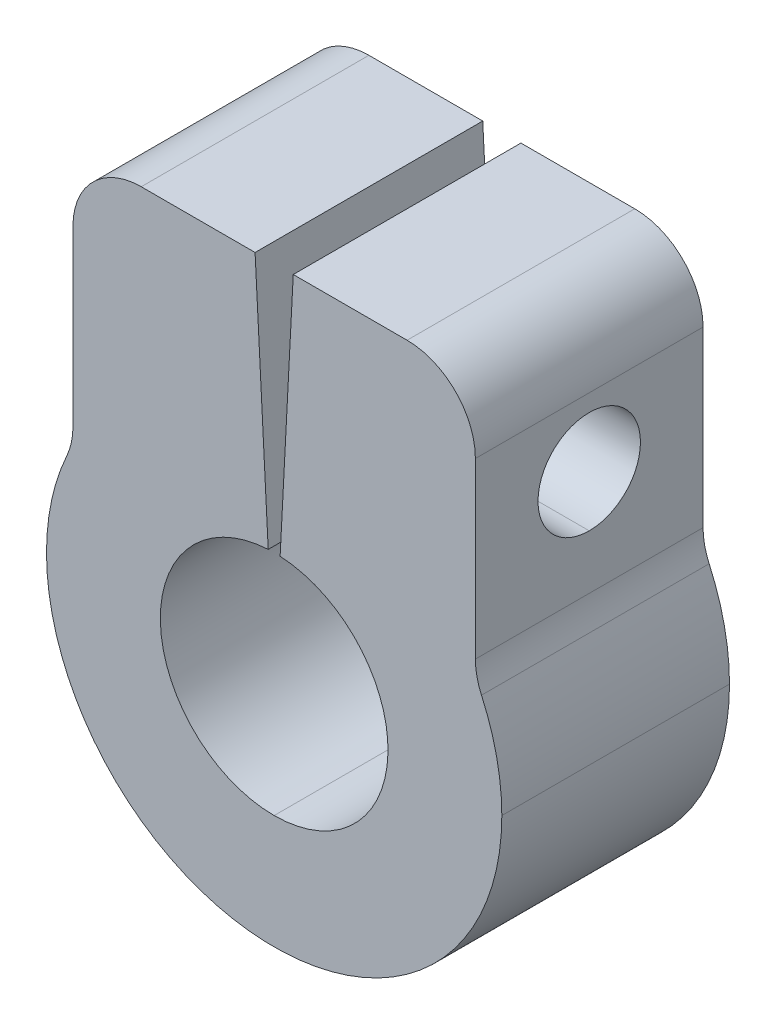
ISO-10303-21;
HEADER;
FILE_DESCRIPTION(('STEP AP214'),'2;1');
FILE_NAME('part.step','',(''),(''),'','','');
FILE_SCHEMA(('AUTOMOTIVE_DESIGN { 1 0 10303 214 1 1 1 1 }'));
ENDSEC;
DATA;
#1=APPLICATION_CONTEXT('core data for automotive mechanical design processes');
#2=APPLICATION_PROTOCOL_DEFINITION('international standard','automotive_design',2000,#1);
#3=PRODUCT_CONTEXT('',#1,'mechanical');
#4=PRODUCT('Part','Part','',(#3));
#5=PRODUCT_RELATED_PRODUCT_CATEGORY('part','',(#4));
#6=PRODUCT_DEFINITION_FORMATION('','',#4);
#7=PRODUCT_DEFINITION_CONTEXT('part definition',#1,'design');
#8=PRODUCT_DEFINITION('design','',#6,#7);
#9=PRODUCT_DEFINITION_SHAPE('','',#8);
#10=(LENGTH_UNIT() NAMED_UNIT(*) SI_UNIT(.MILLI.,.METRE.));
#11=(NAMED_UNIT(*) PLANE_ANGLE_UNIT() SI_UNIT($,.RADIAN.));
#12=(NAMED_UNIT(*) SI_UNIT($,.STERADIAN.) SOLID_ANGLE_UNIT());
#13=UNCERTAINTY_MEASURE_WITH_UNIT(LENGTH_MEASURE(1.E-05),#10,'distance_accuracy_value','');
#14=(GEOMETRIC_REPRESENTATION_CONTEXT(3) GLOBAL_UNCERTAINTY_ASSIGNED_CONTEXT((#13)) GLOBAL_UNIT_ASSIGNED_CONTEXT((#10,
#11,#12)) REPRESENTATION_CONTEXT('',''));
#15=CARTESIAN_POINT('',(0.,0.,0.));
#16=DIRECTION('',(0.,0.,1.));
#17=DIRECTION('',(1.,0.,0.));
#18=AXIS2_PLACEMENT_3D('',#15,#16,#17);
#19=CARTESIAN_POINT('',(3.83852446853,0.,0.));
#20=DIRECTION('',(1.,0.,0.));
#21=DIRECTION('',(0.,1.,0.));
#22=AXIS2_PLACEMENT_3D('',#19,#20,#21);
#23=PLANE('',#22);
#24=CARTESIAN_POINT('',(3.83852446853,10.,5.));
#25=DIRECTION('',(1.,0.,0.));
#26=DIRECTION('',(0.,-1.,0.));
#27=AXIS2_PLACEMENT_3D('',#24,#25,#26);
#28=CIRCLE('',#27,1.8);
#29=CARTESIAN_POINT('',(3.83852446853,8.2,5.));
#30=VERTEX_POINT('',#29);
#31=CARTESIAN_POINT('',(3.83852446853,11.8,5.));
#32=VERTEX_POINT('',#31);
#33=EDGE_CURVE('E268',#30,#32,#28,.T.);
#34=ORIENTED_EDGE('',*,*,#33,.F.);
#35=CARTESIAN_POINT('',(3.83852446853,10.,5.));
#36=DIRECTION('',(1.,0.,0.));
#37=DIRECTION('',(0.,-1.,0.));
#38=AXIS2_PLACEMENT_3D('',#35,#36,#37);
#39=CIRCLE('',#38,1.8);
#40=EDGE_CURVE('E305',#32,#30,#39,.T.);
#41=ORIENTED_EDGE('',*,*,#40,.F.);
#42=EDGE_LOOP('',(#34,#41));
#43=FACE_BOUND('',#42,.T.);
#44=CARTESIAN_POINT('',(3.83852446853,10.,5.));
#45=DIRECTION('',(1.,0.,0.));
#46=DIRECTION('',(0.,1.,0.));
#47=AXIS2_PLACEMENT_3D('',#44,#45,#46);
#48=CIRCLE('',#47,2.25);
#49=CARTESIAN_POINT('',(3.83852446853,12.25,5.));
#50=VERTEX_POINT('',#49);
#51=CARTESIAN_POINT('',(3.83852446853,7.75,5.));
#52=VERTEX_POINT('',#51);
#53=EDGE_CURVE('E29',#50,#52,#48,.T.);
#54=ORIENTED_EDGE('',*,*,#53,.T.);
#55=CARTESIAN_POINT('',(3.83852446853,10.,5.));
#56=DIRECTION('',(1.,0.,0.));
#57=DIRECTION('',(0.,1.,0.));
#58=AXIS2_PLACEMENT_3D('',#55,#56,#57);
#59=CIRCLE('',#58,2.25);
#60=EDGE_CURVE('E11',#52,#50,#59,.T.);
#61=ORIENTED_EDGE('',*,*,#60,.T.);
#62=EDGE_LOOP('',(#54,#61));
#63=FACE_BOUND('',#62,.T.);
#64=ADVANCED_FACE('F16',(#43,#63),#23,.T.);
#65=CARTESIAN_POINT('',(6.33852446853,10.,5.));
#66=DIRECTION('',(1.,0.,0.));
#67=DIRECTION('',(0.,1.,0.));
#68=AXIS2_PLACEMENT_3D('',#65,#66,#67);
#69=CYLINDRICAL_SURFACE('',#68,2.25);
#70=DIRECTION('',(-1.,0.,0.));
#71=VECTOR('',#70,1.);
#72=CARTESIAN_POINT('',(6.33852446853,7.75,5.));
#73=LINE('',#72,#71);
#74=CARTESIAN_POINT('',(8.83852446853,7.75,5.));
#75=VERTEX_POINT('',#74);
#76=EDGE_CURVE('E259',#75,#52,#73,.T.);
#77=ORIENTED_EDGE('',*,*,#76,.F.);
#78=CARTESIAN_POINT('',(8.83852446853,10.,5.));
#79=DIRECTION('',(1.,0.,0.));
#80=DIRECTION('',(0.,1.,0.));
#81=AXIS2_PLACEMENT_3D('',#78,#79,#80);
#82=CIRCLE('',#81,2.25);
#83=CARTESIAN_POINT('',(8.83852446853,12.25,5.));
#84=VERTEX_POINT('',#83);
#85=EDGE_CURVE('E294',#75,#84,#82,.T.);
#86=ORIENTED_EDGE('',*,*,#85,.T.);
#87=DIRECTION('',(-1.,0.,0.));
#88=VECTOR('',#87,1.);
#89=CARTESIAN_POINT('',(6.33852446853,12.25,5.));
#90=LINE('',#89,#88);
#91=EDGE_CURVE('E265',#84,#50,#90,.T.);
#92=ORIENTED_EDGE('',*,*,#91,.T.);
#93=ORIENTED_EDGE('',*,*,#60,.F.);
#94=EDGE_LOOP('',(#77,#86,#92,#93));
#95=FACE_BOUND('',#94,.T.);
#96=ADVANCED_FACE('F404',(#95),#69,.F.);
#97=CARTESIAN_POINT('',(6.33852446853,10.,5.));
#98=DIRECTION('',(1.,0.,0.));
#99=DIRECTION('',(0.,1.,0.));
#100=AXIS2_PLACEMENT_3D('',#97,#98,#99);
#101=CYLINDRICAL_SURFACE('',#100,2.25);
#102=ORIENTED_EDGE('',*,*,#91,.F.);
#103=CARTESIAN_POINT('',(8.83852446853,10.,5.));
#104=DIRECTION('',(1.,0.,0.));
#105=DIRECTION('',(0.,1.,0.));
#106=AXIS2_PLACEMENT_3D('',#103,#104,#105);
#107=CIRCLE('',#106,2.25);
#108=EDGE_CURVE('E290',#84,#75,#107,.T.);
#109=ORIENTED_EDGE('',*,*,#108,.T.);
#110=ORIENTED_EDGE('',*,*,#76,.T.);
#111=ORIENTED_EDGE('',*,*,#53,.F.);
#112=EDGE_LOOP('',(#102,#109,#110,#111));
#113=FACE_BOUND('',#112,.T.);
#114=ADVANCED_FACE('F337',(#113),#101,.F.);
#115=CARTESIAN_POINT('',(1.24073776589,10.,5.));
#116=DIRECTION('',(-1.,0.,0.));
#117=DIRECTION('',(0.,-1.,0.));
#118=AXIS2_PLACEMENT_3D('',#115,#116,#117);
#119=CYLINDRICAL_SURFACE('',#118,1.8);
#120=ORIENTED_EDGE('',*,*,#33,.T.);
#121=DIRECTION('',(1.,0.,0.));
#122=VECTOR('',#121,1.);
#123=CARTESIAN_POINT('',(1.24073776589,11.8,5.));
#124=LINE('',#123,#122);
#125=CARTESIAN_POINT('',(0.618411752958,11.8,5.));
#126=VERTEX_POINT('',#125);
#127=EDGE_CURVE('E304',#126,#32,#124,.T.);
#128=ORIENTED_EDGE('',*,*,#127,.F.);
#129=CARTESIAN_POINT('',(0.618411752958,11.7999991875,5.00000026876));
#130=CARTESIAN_POINT('',(0.618411734733,11.7999988397,4.88705899614));
#131=CARTESIAN_POINT('',(0.617947495724,11.7911406318,4.77411701174));
#132=CARTESIAN_POINT('',(0.61701905562,11.7734249392,4.66210393626));
#133=CARTESIAN_POINT('',(0.613454770989,11.705414337,4.37861529819));
#134=CARTESIAN_POINT('',(0.606967396461,11.5816278569,4.11327260823));
#135=CARTESIAN_POINT('',(0.601966433779,11.4862038044,3.96124673072));
#136=CARTESIAN_POINT('',(0.590099197065,11.2597634385,3.68378939528));
#137=CARTESIAN_POINT('',(0.57505802853,10.9727608458,3.46976867483));
#138=CARTESIAN_POINT('',(0.566875737058,10.8166334238,3.38106194261));
#139=CARTESIAN_POINT('',(0.54952780123,10.485615089,3.24396078378));
#140=CARTESIAN_POINT('',(0.530956233801,10.1312484724,3.19149135789));
#141=CARTESIAN_POINT('',(0.521541164944,9.95159825657,3.18738134241));
#142=CARTESIAN_POINT('',(0.502852996628,9.5950067625,3.22361000683));
#143=CARTESIAN_POINT('',(0.48518607424,9.25790180155,3.34553801637));
#144=CARTESIAN_POINT('',(0.476791689161,9.09772739244,3.42714293331));
#145=CARTESIAN_POINT('',(0.461239747748,8.8009786726,3.62816138808));
#146=CARTESIAN_POINT('',(0.448715141998,8.56199495832,3.89543469032));
#147=CARTESIAN_POINT('',(0.443354879942,8.45971506534,4.04319824792));
#148=CARTESIAN_POINT('',(0.435853444221,8.316579145,4.3172741031));
#149=CARTESIAN_POINT('',(0.4315611125,8.23467657672,4.61434465048));
#150=CARTESIAN_POINT('',(0.430349548877,8.21155856563,4.74197438003));
#151=CARTESIAN_POINT('',(0.429743790121,8.2,4.87098707619));
#152=CARTESIAN_POINT('',(0.429743790121,8.2,5.));
#153=(BOUNDED_CURVE() B_SPLINE_CURVE(5,(#129,#130,#131,#132,#133,#134,#135,#136,#137,#138,#139,
#140,#141,#142,#143,#144,#145,#146,#147,#148,#149,#150,#151,#152),.UNSPECIFIED.,.F.,
.F.) B_SPLINE_CURVE_WITH_KNOTS((6,3,3,3,3,3,3,6),(8.00259127885,8.80119512053,10.0578649018,
11.3158979173,12.5752537973,13.834702192,15.0929280716,16.0051872045),
.UNSPECIFIED.) CURVE() GEOMETRIC_REPRESENTATION_ITEM() RATIONAL_B_SPLINE_CURVE((1.,1.,1.,1.,1.,
1.,1.,1.,1.,1.,1.,1.,1.,1.,1.,1.,1.,1.,1.,1.,1.,1.,1.,1.)) REPRESENTATION_ITEM(''));
#154=CARTESIAN_POINT('',(0.429743790121,8.2,5.));
#155=VERTEX_POINT('',#154);
#156=EDGE_CURVE('E275',#126,#155,#153,.T.);
#157=ORIENTED_EDGE('',*,*,#156,.T.);
#158=DIRECTION('',(1.,0.,0.));
#159=VECTOR('',#158,1.);
#160=CARTESIAN_POINT('',(1.24073776589,8.2,5.));
#161=LINE('',#160,#159);
#162=EDGE_CURVE('E300',#155,#30,#161,.T.);
#163=ORIENTED_EDGE('',*,*,#162,.T.);
#164=EDGE_LOOP('',(#120,#128,#157,#163));
#165=FACE_BOUND('',#164,.T.);
#166=ADVANCED_FACE('F420',(#165),#119,.F.);
#167=CARTESIAN_POINT('',(1.24073776589,10.,5.));
#168=DIRECTION('',(-1.,0.,0.));
#169=DIRECTION('',(0.,-1.,0.));
#170=AXIS2_PLACEMENT_3D('',#167,#168,#169);
#171=CYLINDRICAL_SURFACE('',#170,1.8);
#172=ORIENTED_EDGE('',*,*,#40,.T.);
#173=ORIENTED_EDGE('',*,*,#162,.F.);
#174=CARTESIAN_POINT('',(0.429743790121,8.2,5.));
#175=CARTESIAN_POINT('',(0.429743790121,8.2,5.17715834486));
#176=CARTESIAN_POINT('',(0.43088602783,8.22179519385,5.35431626044));
#177=CARTESIAN_POINT('',(0.433170821966,8.26539166306,5.52789685169));
#178=CARTESIAN_POINT('',(0.439941729453,8.39458827433,5.86128970674));
#179=CARTESIAN_POINT('',(0.450748624299,8.60079611206,6.15328642236));
#180=CARTESIAN_POINT('',(0.457084442778,8.72169073047,6.28597903457));
#181=CARTESIAN_POINT('',(0.471345427923,8.99380653734,6.51888524048));
#182=CARTESIAN_POINT('',(0.488141175103,9.31428848506,6.67859852511));
#183=CARTESIAN_POINT('',(0.497021016269,9.4837259481,6.73820000477));
#184=CARTESIAN_POINT('',(0.515372096004,9.83388540889,6.81436953722));
#185=CARTESIAN_POINT('',(0.534141985149,10.1920362293,6.80307146368));
#186=CARTESIAN_POINT('',(0.543447536952,10.3695967352,6.77520455062));
#187=CARTESIAN_POINT('',(0.561502167519,10.7140996089,6.67620345004));
#188=CARTESIAN_POINT('',(0.577755117502,11.0242243691,6.49629988068));
#189=CARTESIAN_POINT('',(0.585255943417,11.1673486536,6.38754133035));
#190=CARTESIAN_POINT('',(0.598687391248,11.4236359456,6.13702933554));
#191=CARTESIAN_POINT('',(0.608523558656,11.6113212004,5.83159259803));
#192=CARTESIAN_POINT('',(0.612422265251,11.6857129539,5.66805220271));
#193=CARTESIAN_POINT('',(0.616241761244,11.758593279,5.43473726791));
#194=CARTESIAN_POINT('',(0.617953958912,11.7912639567,5.19409141906));
#195=CARTESIAN_POINT('',(0.618259166629,11.7970876669,5.12951141572));
#196=CARTESIAN_POINT('',(0.618411763407,11.7999993869,5.06475595924));
#197=CARTESIAN_POINT('',(0.618411752958,11.7999991875,5.00000026876));
#198=(BOUNDED_CURVE() B_SPLINE_CURVE(5,(#174,#175,#176,#177,#178,#179,#180,#181,#182,#183,#184,
#185,#186,#187,#188,#189,#190,#191,#192,#193,#194,#195,#196,#197),.UNSPECIFIED.,.F.,
.F.) B_SPLINE_CURVE_WITH_KNOTS((6,3,3,3,3,3,3,6),(0.,1.25269866993,2.50977394303,3.76836628109,
5.02793231457,6.28705185936,7.54470602589,8.00259127885),
.UNSPECIFIED.) CURVE() GEOMETRIC_REPRESENTATION_ITEM() RATIONAL_B_SPLINE_CURVE((1.,1.,1.,1.,1.,
1.,1.,1.,1.,1.,1.,1.,1.,1.,1.,1.,1.,1.,1.,1.,1.,1.,1.,1.)) REPRESENTATION_ITEM(''));
#199=EDGE_CURVE('E269',#155,#126,#198,.T.);
#200=ORIENTED_EDGE('',*,*,#199,.T.);
#201=ORIENTED_EDGE('',*,*,#127,.T.);
#202=EDGE_LOOP('',(#172,#173,#200,#201));
#203=FACE_BOUND('',#202,.T.);
#204=ADVANCED_FACE('F422',(#203),#171,.F.);
#205=CARTESIAN_POINT('',(8.83852446853,4.67765809131,0.));
#206=DIRECTION('',(1.,0.,0.));
#207=DIRECTION('',(0.,1.,0.));
#208=AXIS2_PLACEMENT_3D('',#205,#206,#207);
#209=PLANE('',#208);
#210=ORIENTED_EDGE('',*,*,#108,.F.);
#211=ORIENTED_EDGE('',*,*,#85,.F.);
#212=EDGE_LOOP('',(#210,#211));
#213=FACE_BOUND('',#212,.T.);
#214=DIRECTION('',(0.,1.,0.));
#215=VECTOR('',#214,1.);
#216=CARTESIAN_POINT('',(8.83852446853,9.18557900685,10.));
#217=LINE('',#216,#215);
#218=CARTESIAN_POINT('',(8.83852446853,5.37115801369,10.));
#219=VERTEX_POINT('',#218);
#220=CARTESIAN_POINT('',(8.83852446853,13.,10.));
#221=VERTEX_POINT('',#220);
#222=EDGE_CURVE('E251',#219,#221,#217,.T.);
#223=ORIENTED_EDGE('',*,*,#222,.F.);
#224=DIRECTION('',(0.,0.,-1.));
#225=VECTOR('',#224,1.);
#226=CARTESIAN_POINT('',(8.83852446853,5.37115801369,5.));
#227=LINE('',#226,#225);
#228=CARTESIAN_POINT('',(8.83852446853,5.37115801369,0.));
#229=VERTEX_POINT('',#228);
#230=EDGE_CURVE('E114',#219,#229,#227,.T.);
#231=ORIENTED_EDGE('',*,*,#230,.T.);
#232=DIRECTION('',(0.,1.,0.));
#233=VECTOR('',#232,1.);
#234=CARTESIAN_POINT('',(8.83852446853,9.18557900685,0.));
#235=LINE('',#234,#233);
#236=CARTESIAN_POINT('',(8.83852446853,13.,0.));
#237=VERTEX_POINT('',#236);
#238=EDGE_CURVE('E513',#229,#237,#235,.T.);
#239=ORIENTED_EDGE('',*,*,#238,.T.);
#240=DIRECTION('',(0.,0.,1.));
#241=VECTOR('',#240,1.);
#242=CARTESIAN_POINT('',(8.83852446853,13.,5.));
#243=LINE('',#242,#241);
#244=EDGE_CURVE('E492',#237,#221,#243,.T.);
#245=ORIENTED_EDGE('',*,*,#244,.T.);
#246=EDGE_LOOP('',(#223,#231,#239,#245));
#247=FACE_BOUND('',#246,.T.);
#248=ADVANCED_FACE('F335',(#213,#247),#209,.T.);
#249=CARTESIAN_POINT('',(0.,0.,10.));
#250=DIRECTION('',(-0.998629534754577,-0.0523359562428779,0.));
#251=DIRECTION('',(-0.0523359562428779,0.998629534754577,0.));
#252=AXIS2_PLACEMENT_3D('',#249,#250,#251);
#253=PLANE('',#252);
#254=CARTESIAN_POINT('',(-0.618411795422473,11.7999999977745,5.));
#255=CARTESIAN_POINT('',(-0.618411795264247,11.7999999947554,4.64201942170347));
#256=CARTESIAN_POINT('',(-0.611221660431828,11.6628040492146,4.31076712726656));
#257=CARTESIAN_POINT('',(-0.604049243791205,11.5259461869134,3.98033111678292));
#258=CARTESIAN_POINT('',(-0.590759093261236,11.2723550080503,3.72677076306773));
#259=CARTESIAN_POINT('',(-0.577513321448016,11.0196106255474,3.47405710278094));
#260=CARTESIAN_POINT('',(-0.560156411263838,10.6884210498461,3.33687794688339));
#261=CARTESIAN_POINT('',(-0.542854483568834,10.3582806025361,3.20013334133924));
#262=CARTESIAN_POINT('',(-0.524077356085507,9.99999166642339,3.20001170018805));
#263=CARTESIAN_POINT('',(-0.505348026532932,9.64261476916076,3.1998903686793));
#264=CARTESIAN_POINT('',(-0.487999471428814,9.31158461788408,3.3368649941619));
#265=CARTESIAN_POINT('',(-0.470699977999562,8.98149061913165,3.47345225571132));
#266=CARTESIAN_POINT('',(-0.457404418360603,8.7277962283205,3.72692525612255));
#267=CARTESIAN_POINT('',(-0.444143340891794,8.47475979651128,3.9797408717101));
#268=CARTESIAN_POINT('',(-0.436938476719694,8.33728279842677,4.31085915006924));
#269=CARTESIAN_POINT('',(-0.429743790120396,8.20000000000002,4.64150969159072));
#270=CARTESIAN_POINT('',(-0.429743790120396,8.20000000000002,5.));
#271=B_SPLINE_CURVE_WITH_KNOTS('',2,(#254,#255,#256,#257,#258,#259,#260,#261,#262,#263,#264,
#265,#266,#267,#268,#269,#270),.UNSPECIFIED.,.F.,.F.,(3,2,2,2,2,2,2,2,3),(0.,0.125,0.25,0.375,
0.5,0.625,0.75,0.875,1.),.UNSPECIFIED.);
#272=CARTESIAN_POINT('',(-0.618411752958,11.8,5.));
#273=VERTEX_POINT('',#272);
#274=CARTESIAN_POINT('',(-0.429743790121,8.2,5.));
#275=VERTEX_POINT('',#274);
#276=EDGE_CURVE('E354',#273,#275,#271,.T.);
#277=ORIENTED_EDGE('',*,*,#276,.T.);
#278=CARTESIAN_POINT('',(-0.429743790120396,8.20000000000002,5.));
#279=CARTESIAN_POINT('',(-0.429743790120396,8.20000000000002,5.35797282038658));
#280=CARTESIAN_POINT('',(-0.436940458677937,8.33732061644291,5.68909253990796));
#281=CARTESIAN_POINT('',(-0.444115278832796,8.47422434052782,6.01920701138854));
#282=CARTESIAN_POINT('',(-0.457410493782119,8.72791215426889,6.2729292562737));
#283=CARTESIAN_POINT('',(-0.470662704303405,8.98077939464042,6.52583081641907));
#284=CARTESIAN_POINT('',(-0.488002617235567,9.31164464345273,6.6630658405284));
#285=CARTESIAN_POINT('',(-0.505295154015199,9.64160590142286,6.79992591076915));
#286=CARTESIAN_POINT('',(-0.524077517200773,9.99999474068582,6.79999403855485));
#287=CARTESIAN_POINT('',(-0.542791706448397,10.3570827437202,6.8000619190586));
#288=CARTESIAN_POINT('',(-0.560143390599193,10.6881726007642,6.66278608465309));
#289=CARTESIAN_POINT('',(-0.577432885157199,11.0180758096877,6.52600225598993));
#290=CARTESIAN_POINT('',(-0.590733844645774,11.2718732357675,6.2726036106405));
#291=CARTESIAN_POINT('',(-0.604004856604983,11.5250992289459,6.01977550032496));
#292=CARTESIAN_POINT('',(-0.611211908778972,11.6626179765936,5.68900444899436));
#293=CARTESIAN_POINT('',(-0.618411795580956,11.8000000007986,5.35856225578409));
#294=CARTESIAN_POINT('',(-0.618411795422473,11.7999999977745,5.));
#295=B_SPLINE_CURVE_WITH_KNOTS('',2,(#278,#279,#280,#281,#282,#283,#284,#285,#286,#287,#288,
#289,#290,#291,#292,#293,#294),.UNSPECIFIED.,.F.,.F.,(3,2,2,2,2,2,2,2,3),(0.,0.125,0.25,0.375,
0.5,0.625,0.75,0.875,1.),.UNSPECIFIED.);
#296=EDGE_CURVE('E283',#275,#273,#295,.T.);
#297=ORIENTED_EDGE('',*,*,#296,.T.);
#298=EDGE_LOOP('',(#277,#297));
#299=FACE_BOUND('',#298,.T.);
#300=DIRECTION('',(0.,0.,-1.));
#301=VECTOR('',#300,1.);
#302=CARTESIAN_POINT('',(-0.261679781215,4.99314767377,5.));
#303=LINE('',#302,#301);
#304=CARTESIAN_POINT('',(-0.261679781215,4.99314767377,10.));
#305=VERTEX_POINT('',#304);
#306=CARTESIAN_POINT('',(-0.261679781215,4.99314767377,0.));
#307=VERTEX_POINT('',#306);
#308=EDGE_CURVE('E312',#305,#307,#303,.T.);
#309=ORIENTED_EDGE('',*,*,#308,.T.);
#310=DIRECTION('',(-0.0523359562428779,0.998629534754577,0.));
#311=VECTOR('',#310,1.);
#312=CARTESIAN_POINT('',(-0.550102124872,10.4965738369,0.));
#313=LINE('',#312,#311);
#314=CARTESIAN_POINT('',(-0.838524468529,16.,0.));
#315=VERTEX_POINT('',#314);
#316=EDGE_CURVE('E263',#307,#315,#313,.T.);
#317=ORIENTED_EDGE('',*,*,#316,.T.);
#318=DIRECTION('',(0.,0.,1.));
#319=VECTOR('',#318,1.);
#320=CARTESIAN_POINT('',(-0.838524468529,16.,5.));
#321=LINE('',#320,#319);
#322=CARTESIAN_POINT('',(-0.838524468529,16.,10.));
#323=VERTEX_POINT('',#322);
#324=EDGE_CURVE('E295',#315,#323,#321,.T.);
#325=ORIENTED_EDGE('',*,*,#324,.T.);
#326=DIRECTION('',(-0.0523359562428779,0.998629534754577,0.));
#327=VECTOR('',#326,1.);
#328=CARTESIAN_POINT('',(-0.550102124872,10.4965738369,10.));
#329=LINE('',#328,#327);
#330=EDGE_CURVE('E288',#305,#323,#329,.T.);
#331=ORIENTED_EDGE('',*,*,#330,.F.);
#332=EDGE_LOOP('',(#309,#317,#325,#331));
#333=FACE_BOUND('',#332,.T.);
#334=ADVANCED_FACE('F324',(#299,#333),#253,.F.);
#335=CARTESIAN_POINT('',(8.83852446853,16.,0.));
#336=DIRECTION('',(0.,1.,0.));
#337=DIRECTION('',(1.,0.,0.));
#338=AXIS2_PLACEMENT_3D('',#335,#336,#337);
#339=PLANE('',#338);
#340=DIRECTION('',(-1.,0.,0.));
#341=VECTOR('',#340,1.);
#342=CARTESIAN_POINT('',(-3.33852446853,16.,10.));
#343=LINE('',#342,#341);
#344=CARTESIAN_POINT('',(-5.83852446853,16.,10.));
#345=VERTEX_POINT('',#344);
#346=EDGE_CURVE('E536',#323,#345,#343,.T.);
#347=ORIENTED_EDGE('',*,*,#346,.F.);
#348=ORIENTED_EDGE('',*,*,#324,.F.);
#349=DIRECTION('',(-1.,0.,0.));
#350=VECTOR('',#349,1.);
#351=CARTESIAN_POINT('',(-3.33852446853,16.,0.));
#352=LINE('',#351,#350);
#353=CARTESIAN_POINT('',(-5.83852446853,16.,0.));
#354=VERTEX_POINT('',#353);
#355=EDGE_CURVE('E260',#315,#354,#352,.T.);
#356=ORIENTED_EDGE('',*,*,#355,.T.);
#357=DIRECTION('',(0.,0.,1.));
#358=VECTOR('',#357,1.);
#359=CARTESIAN_POINT('',(-5.83852446853,16.,5.));
#360=LINE('',#359,#358);
#361=EDGE_CURVE('E504',#354,#345,#360,.T.);
#362=ORIENTED_EDGE('',*,*,#361,.T.);
#363=EDGE_LOOP('',(#347,#348,#356,#362));
#364=FACE_BOUND('',#363,.T.);
#365=ADVANCED_FACE('F334',(#364),#339,.T.);
#366=CARTESIAN_POINT('',(-11.8385244685,5.37115801369,5.));
#367=DIRECTION('',(0.,0.,-1.));
#368=DIRECTION('',(1.,0.,0.));
#369=AXIS2_PLACEMENT_3D('',#366,#367,#368);
#370=CYLINDRICAL_SURFACE('',#369,3.);
#371=DIRECTION('',(0.,0.,-1.));
#372=VECTOR('',#371,1.);
#373=CARTESIAN_POINT('',(-9.10655728348,4.13166001053,5.61000000001));
#374=LINE('',#373,#372);
#375=CARTESIAN_POINT('',(-9.10655728348,4.13166001053,10.));
#376=VERTEX_POINT('',#375);
#377=CARTESIAN_POINT('',(-9.10655728348,4.13166001053,0.));
#378=VERTEX_POINT('',#377);
#379=EDGE_CURVE('E218',#376,#378,#374,.T.);
#380=ORIENTED_EDGE('',*,*,#379,.F.);
#381=CARTESIAN_POINT('',(-11.8385244685,5.37115801369,10.));
#382=DIRECTION('',(0.,0.,-1.));
#383=DIRECTION('',(1.,0.,0.));
#384=AXIS2_PLACEMENT_3D('',#381,#382,#383);
#385=CIRCLE('',#384,3.);
#386=CARTESIAN_POINT('',(-8.83852446853,5.37115801369,10.));
#387=VERTEX_POINT('',#386);
#388=EDGE_CURVE('E211',#387,#376,#385,.T.);
#389=ORIENTED_EDGE('',*,*,#388,.F.);
#390=DIRECTION('',(0.,0.,-1.));
#391=VECTOR('',#390,1.);
#392=CARTESIAN_POINT('',(-8.83852446853,5.37115801369,5.));
#393=LINE('',#392,#391);
#394=CARTESIAN_POINT('',(-8.83852446853,5.37115801369,0.));
#395=VERTEX_POINT('',#394);
#396=EDGE_CURVE('E216',#387,#395,#393,.T.);
#397=ORIENTED_EDGE('',*,*,#396,.T.);
#398=CARTESIAN_POINT('',(-11.8385244685,5.37115801369,0.));
#399=DIRECTION('',(0.,0.,1.));
#400=DIRECTION('',(1.,0.,0.));
#401=AXIS2_PLACEMENT_3D('',#398,#399,#400);
#402=CIRCLE('',#401,3.);
#403=EDGE_CURVE('E224',#378,#395,#402,.T.);
#404=ORIENTED_EDGE('',*,*,#403,.F.);
#405=EDGE_LOOP('',(#380,#389,#397,#404));
#406=FACE_BOUND('',#405,.T.);
#407=ADVANCED_FACE('F213',(#406),#370,.F.);
#408=CARTESIAN_POINT('',(0.,0.,5.));
#409=DIRECTION('',(0.,0.,1.));
#410=DIRECTION('',(1.,0.,0.));
#411=AXIS2_PLACEMENT_3D('',#408,#409,#410);
#412=CYLINDRICAL_SURFACE('',#411,10.);
#413=CARTESIAN_POINT('',(0.,0.,0.));
#414=DIRECTION('',(0.,0.,1.));
#415=DIRECTION('',(1.,0.,0.));
#416=AXIS2_PLACEMENT_3D('',#413,#414,#415);
#417=CIRCLE('',#416,10.);
#418=CARTESIAN_POINT('',(-10.,0.,0.));
#419=VERTEX_POINT('',#418);
#420=EDGE_CURVE('E518',#378,#419,#417,.T.);
#421=ORIENTED_EDGE('',*,*,#420,.T.);
#422=DIRECTION('',(0.,0.,1.));
#423=VECTOR('',#422,1.);
#424=CARTESIAN_POINT('',(-10.,0.,5.61000000001));
#425=LINE('',#424,#423);
#426=CARTESIAN_POINT('',(-10.,0.,10.));
#427=VERTEX_POINT('',#426);
#428=EDGE_CURVE('E296',#419,#427,#425,.T.);
#429=ORIENTED_EDGE('',*,*,#428,.T.);
#430=CARTESIAN_POINT('',(0.,0.,10.));
#431=DIRECTION('',(0.,0.,1.));
#432=DIRECTION('',(1.,0.,0.));
#433=AXIS2_PLACEMENT_3D('',#430,#431,#432);
#434=CIRCLE('',#433,10.);
#435=EDGE_CURVE('E223',#376,#427,#434,.T.);
#436=ORIENTED_EDGE('',*,*,#435,.F.);
#437=ORIENTED_EDGE('',*,*,#379,.T.);
#438=EDGE_LOOP('',(#421,#429,#436,#437));
#439=FACE_BOUND('',#438,.T.);
#440=ADVANCED_FACE('F414',(#439),#412,.T.);
#441=CARTESIAN_POINT('',(0.,0.,5.));
#442=DIRECTION('',(0.,0.,1.));
#443=DIRECTION('',(1.,0.,0.));
#444=AXIS2_PLACEMENT_3D('',#441,#442,#443);
#445=CYLINDRICAL_SURFACE('',#444,10.);
#446=ORIENTED_EDGE('',*,*,#428,.F.);
#447=CARTESIAN_POINT('',(0.,0.,0.));
#448=DIRECTION('',(0.,0.,1.));
#449=DIRECTION('',(1.,0.,0.));
#450=AXIS2_PLACEMENT_3D('',#447,#448,#449);
#451=CIRCLE('',#450,10.);
#452=CARTESIAN_POINT('',(10.,0.,0.));
#453=VERTEX_POINT('',#452);
#454=EDGE_CURVE('E522',#419,#453,#451,.T.);
#455=ORIENTED_EDGE('',*,*,#454,.T.);
#456=DIRECTION('',(0.,0.,1.));
#457=VECTOR('',#456,1.);
#458=CARTESIAN_POINT('',(10.,0.,5.61000000001));
#459=LINE('',#458,#457);
#460=CARTESIAN_POINT('',(10.,0.,10.));
#461=VERTEX_POINT('',#460);
#462=EDGE_CURVE('E299',#453,#461,#459,.T.);
#463=ORIENTED_EDGE('',*,*,#462,.T.);
#464=CARTESIAN_POINT('',(0.,0.,10.));
#465=DIRECTION('',(0.,0.,1.));
#466=DIRECTION('',(1.,0.,0.));
#467=AXIS2_PLACEMENT_3D('',#464,#465,#466);
#468=CIRCLE('',#467,10.);
#469=EDGE_CURVE('E490',#427,#461,#468,.T.);
#470=ORIENTED_EDGE('',*,*,#469,.F.);
#471=EDGE_LOOP('',(#446,#455,#463,#470));
#472=FACE_BOUND('',#471,.T.);
#473=ADVANCED_FACE('F394',(#472),#445,.T.);
#474=CARTESIAN_POINT('',(0.,0.,5.));
#475=DIRECTION('',(0.,0.,1.));
#476=DIRECTION('',(1.,0.,0.));
#477=AXIS2_PLACEMENT_3D('',#474,#475,#476);
#478=CYLINDRICAL_SURFACE('',#477,10.);
#479=CARTESIAN_POINT('',(0.,0.,10.));
#480=DIRECTION('',(0.,0.,1.));
#481=DIRECTION('',(1.,0.,0.));
#482=AXIS2_PLACEMENT_3D('',#479,#480,#481);
#483=CIRCLE('',#482,10.);
#484=CARTESIAN_POINT('',(9.10655728348,4.13166001053,10.));
#485=VERTEX_POINT('',#484);
#486=EDGE_CURVE('E528',#461,#485,#483,.T.);
#487=ORIENTED_EDGE('',*,*,#486,.F.);
#488=ORIENTED_EDGE('',*,*,#462,.F.);
#489=CARTESIAN_POINT('',(0.,0.,0.));
#490=DIRECTION('',(0.,0.,1.));
#491=DIRECTION('',(1.,0.,0.));
#492=AXIS2_PLACEMENT_3D('',#489,#490,#491);
#493=CIRCLE('',#492,10.);
#494=CARTESIAN_POINT('',(9.10655728348,4.13166001053,0.));
#495=VERTEX_POINT('',#494);
#496=EDGE_CURVE('E544',#453,#495,#493,.T.);
#497=ORIENTED_EDGE('',*,*,#496,.T.);
#498=DIRECTION('',(0.,0.,-1.));
#499=VECTOR('',#498,1.);
#500=CARTESIAN_POINT('',(9.10655728348,4.13166001053,5.));
#501=LINE('',#500,#499);
#502=EDGE_CURVE('E126',#485,#495,#501,.T.);
#503=ORIENTED_EDGE('',*,*,#502,.F.);
#504=EDGE_LOOP('',(#487,#488,#497,#503));
#505=FACE_BOUND('',#504,.T.);
#506=ADVANCED_FACE('F390',(#505),#478,.T.);
#507=CARTESIAN_POINT('',(5.83852446853,13.,5.));
#508=DIRECTION('',(0.,0.,1.));
#509=DIRECTION('',(1.,0.,0.));
#510=AXIS2_PLACEMENT_3D('',#507,#508,#509);
#511=CYLINDRICAL_SURFACE('',#510,3.);
#512=CARTESIAN_POINT('',(5.83852446853,13.,10.));
#513=DIRECTION('',(0.,0.,-1.));
#514=DIRECTION('',(1.,0.,0.));
#515=AXIS2_PLACEMENT_3D('',#512,#513,#514);
#516=CIRCLE('',#515,3.);
#517=CARTESIAN_POINT('',(5.83852446853,16.,10.));
#518=VERTEX_POINT('',#517);
#519=EDGE_CURVE('E255',#518,#221,#516,.T.);
#520=ORIENTED_EDGE('',*,*,#519,.T.);
#521=ORIENTED_EDGE('',*,*,#244,.F.);
#522=CARTESIAN_POINT('',(5.83852446853,13.,0.));
#523=DIRECTION('',(0.,0.,1.));
#524=DIRECTION('',(1.,0.,0.));
#525=AXIS2_PLACEMENT_3D('',#522,#523,#524);
#526=CIRCLE('',#525,3.);
#527=CARTESIAN_POINT('',(5.83852446853,16.,0.));
#528=VERTEX_POINT('',#527);
#529=EDGE_CURVE('E509',#237,#528,#526,.T.);
#530=ORIENTED_EDGE('',*,*,#529,.T.);
#531=DIRECTION('',(0.,0.,1.));
#532=VECTOR('',#531,1.);
#533=CARTESIAN_POINT('',(5.83852446853,16.,5.));
#534=LINE('',#533,#532);
#535=EDGE_CURVE('E537',#528,#518,#534,.T.);
#536=ORIENTED_EDGE('',*,*,#535,.T.);
#537=EDGE_LOOP('',(#520,#521,#530,#536));
#538=FACE_BOUND('',#537,.T.);
#539=ADVANCED_FACE('F393',(#538),#511,.T.);
#540=CARTESIAN_POINT('',(8.83852446853,16.,0.));
#541=DIRECTION('',(0.,1.,0.));
#542=DIRECTION('',(1.,0.,0.));
#543=AXIS2_PLACEMENT_3D('',#540,#541,#542);
#544=PLANE('',#543);
#545=DIRECTION('',(-1.,0.,0.));
#546=VECTOR('',#545,1.);
#547=CARTESIAN_POINT('',(3.33852446853,16.,0.));
#548=LINE('',#547,#546);
#549=CARTESIAN_POINT('',(0.838524468529,16.,0.));
#550=VERTEX_POINT('',#549);
#551=EDGE_CURVE('E310',#528,#550,#548,.T.);
#552=ORIENTED_EDGE('',*,*,#551,.T.);
#553=DIRECTION('',(0.,0.,1.));
#554=VECTOR('',#553,1.);
#555=CARTESIAN_POINT('',(0.838524468529,16.,5.));
#556=LINE('',#555,#554);
#557=CARTESIAN_POINT('',(0.838524468529,16.,10.));
#558=VERTEX_POINT('',#557);
#559=EDGE_CURVE('E276',#550,#558,#556,.T.);
#560=ORIENTED_EDGE('',*,*,#559,.T.);
#561=DIRECTION('',(-1.,0.,0.));
#562=VECTOR('',#561,1.);
#563=CARTESIAN_POINT('',(3.33852446853,16.,10.));
#564=LINE('',#563,#562);
#565=EDGE_CURVE('E494',#518,#558,#564,.T.);
#566=ORIENTED_EDGE('',*,*,#565,.F.);
#567=ORIENTED_EDGE('',*,*,#535,.F.);
#568=EDGE_LOOP('',(#552,#560,#566,#567));
#569=FACE_BOUND('',#568,.T.);
#570=ADVANCED_FACE('F402',(#569),#544,.T.);
#571=CARTESIAN_POINT('',(0.,0.,10.));
#572=DIRECTION('',(-0.998629534754577,0.0523359562428779,0.));
#573=DIRECTION('',(0.,0.,1.));
#574=AXIS2_PLACEMENT_3D('',#571,#572,#573);
#575=PLANE('',#574);
#576=ORIENTED_EDGE('',*,*,#199,.F.);
#577=ORIENTED_EDGE('',*,*,#156,.F.);
#578=EDGE_LOOP('',(#576,#577));
#579=FACE_BOUND('',#578,.T.);
#580=DIRECTION('',(0.0523359562428779,0.998629534754577,0.));
#581=VECTOR('',#580,1.);
#582=CARTESIAN_POINT('',(0.550102124872,10.4965738369,10.));
#583=LINE('',#582,#581);
#584=CARTESIAN_POINT('',(0.261679781215,4.99314767378,10.));
#585=VERTEX_POINT('',#584);
#586=EDGE_CURVE('E497',#585,#558,#583,.T.);
#587=ORIENTED_EDGE('',*,*,#586,.T.);
#588=ORIENTED_EDGE('',*,*,#559,.F.);
#589=DIRECTION('',(-0.0523359562428779,-0.998629534754577,0.));
#590=VECTOR('',#589,1.);
#591=CARTESIAN_POINT('',(0.550102124872,10.4965738369,0.));
#592=LINE('',#591,#590);
#593=CARTESIAN_POINT('',(0.261679781215,4.99314767378,0.));
#594=VERTEX_POINT('',#593);
#595=EDGE_CURVE('E306',#550,#594,#592,.T.);
#596=ORIENTED_EDGE('',*,*,#595,.T.);
#597=DIRECTION('',(0.,0.,-1.));
#598=VECTOR('',#597,1.);
#599=CARTESIAN_POINT('',(0.261679781215,4.99314767378,5.));
#600=LINE('',#599,#598);
#601=EDGE_CURVE('E464',#585,#594,#600,.T.);
#602=ORIENTED_EDGE('',*,*,#601,.F.);
#603=EDGE_LOOP('',(#587,#588,#596,#602));
#604=FACE_BOUND('',#603,.T.);
#605=ADVANCED_FACE('F459',(#579,#604),#575,.T.);
#606=CARTESIAN_POINT('',(5.41703111629E-11,0.,5.));
#607=DIRECTION('',(0.,0.,1.));
#608=DIRECTION('',(-5.59491172071E-13,1.,0.));
#609=AXIS2_PLACEMENT_3D('',#606,#607,#608);
#610=CYLINDRICAL_SURFACE('',#609,5.);
#611=CARTESIAN_POINT('',(5.41703111629E-11,0.,10.));
#612=DIRECTION('',(0.,0.,1.));
#613=DIRECTION('',(1.,0.,0.));
#614=AXIS2_PLACEMENT_3D('',#611,#612,#613);
#615=CIRCLE('',#614,5.);
#616=CARTESIAN_POINT('',(5.69671546998E-11,-5.,10.));
#617=VERTEX_POINT('',#616);
#618=EDGE_CURVE('E284',#305,#617,#615,.T.);
#619=ORIENTED_EDGE('',*,*,#618,.T.);
#620=DIRECTION('',(0.,0.,1.));
#621=VECTOR('',#620,1.);
#622=CARTESIAN_POINT('',(5.69671546998E-11,-5.,5.));
#623=LINE('',#622,#621);
#624=CARTESIAN_POINT('',(5.69671546998E-11,-5.,0.));
#625=VERTEX_POINT('',#624);
#626=EDGE_CURVE('E249',#625,#617,#623,.T.);
#627=ORIENTED_EDGE('',*,*,#626,.F.);
#628=CARTESIAN_POINT('',(5.41703111629E-11,0.,0.));
#629=DIRECTION('',(0.,0.,1.));
#630=DIRECTION('',(1.,0.,0.));
#631=AXIS2_PLACEMENT_3D('',#628,#629,#630);
#632=CIRCLE('',#631,5.);
#633=EDGE_CURVE('E479',#307,#625,#632,.T.);
#634=ORIENTED_EDGE('',*,*,#633,.F.);
#635=ORIENTED_EDGE('',*,*,#308,.F.);
#636=EDGE_LOOP('',(#619,#627,#634,#635));
#637=FACE_BOUND('',#636,.T.);
#638=ADVANCED_FACE('F453',(#637),#610,.F.);
#639=CARTESIAN_POINT('',(5.41703111629E-11,0.,5.));
#640=DIRECTION('',(0.,0.,1.));
#641=DIRECTION('',(-5.59491172071E-13,1.,0.));
#642=AXIS2_PLACEMENT_3D('',#639,#640,#641);
#643=CYLINDRICAL_SURFACE('',#642,5.);
#644=ORIENTED_EDGE('',*,*,#601,.T.);
#645=CARTESIAN_POINT('',(5.41703111629E-11,0.,0.));
#646=DIRECTION('',(0.,0.,1.));
#647=DIRECTION('',(1.,0.,0.));
#648=AXIS2_PLACEMENT_3D('',#645,#646,#647);
#649=CIRCLE('',#648,5.);
#650=EDGE_CURVE('E311',#625,#594,#649,.T.);
#651=ORIENTED_EDGE('',*,*,#650,.F.);
#652=ORIENTED_EDGE('',*,*,#626,.T.);
#653=CARTESIAN_POINT('',(5.41703111629E-11,0.,10.));
#654=DIRECTION('',(0.,0.,1.));
#655=DIRECTION('',(1.,0.,0.));
#656=AXIS2_PLACEMENT_3D('',#653,#654,#655);
#657=CIRCLE('',#656,5.);
#658=EDGE_CURVE('E289',#617,#585,#657,.T.);
#659=ORIENTED_EDGE('',*,*,#658,.T.);
#660=EDGE_LOOP('',(#644,#651,#652,#659));
#661=FACE_BOUND('',#660,.T.);
#662=ADVANCED_FACE('F18',(#661),#643,.F.);
#663=CARTESIAN_POINT('',(11.8385244685,5.37115801369,5.));
#664=DIRECTION('',(0.,0.,1.));
#665=DIRECTION('',(-1.,0.,0.));
#666=AXIS2_PLACEMENT_3D('',#663,#664,#665);
#667=CYLINDRICAL_SURFACE('',#666,3.);
#668=ORIENTED_EDGE('',*,*,#230,.F.);
#669=CARTESIAN_POINT('',(11.8385244685,5.37115801369,10.));
#670=DIRECTION('',(0.,0.,-1.));
#671=DIRECTION('',(1.,0.,0.));
#672=AXIS2_PLACEMENT_3D('',#669,#670,#671);
#673=CIRCLE('',#672,3.);
#674=EDGE_CURVE('E256',#485,#219,#673,.T.);
#675=ORIENTED_EDGE('',*,*,#674,.F.);
#676=ORIENTED_EDGE('',*,*,#502,.T.);
#677=CARTESIAN_POINT('',(11.8385244685,5.37115801369,0.));
#678=DIRECTION('',(0.,0.,1.));
#679=DIRECTION('',(1.,0.,0.));
#680=AXIS2_PLACEMENT_3D('',#677,#678,#679);
#681=CIRCLE('',#680,3.);
#682=EDGE_CURVE('E532',#229,#495,#681,.T.);
#683=ORIENTED_EDGE('',*,*,#682,.F.);
#684=EDGE_LOOP('',(#668,#675,#676,#683));
#685=FACE_BOUND('',#684,.T.);
#686=ADVANCED_FACE('F446',(#685),#667,.F.);
#687=CARTESIAN_POINT('',(0.,0.,10.));
#688=DIRECTION('',(0.,0.,1.));
#689=DIRECTION('',(1.,0.,0.));
#690=AXIS2_PLACEMENT_3D('',#687,#688,#689);
#691=PLANE('',#690);
#692=DIRECTION('',(0.,1.,0.));
#693=VECTOR('',#692,1.);
#694=CARTESIAN_POINT('',(-8.83852446853,9.18557900685,10.));
#695=LINE('',#694,#693);
#696=CARTESIAN_POINT('',(-8.83852446853,13.,10.));
#697=VERTEX_POINT('',#696);
#698=EDGE_CURVE('E227',#387,#697,#695,.T.);
#699=ORIENTED_EDGE('',*,*,#698,.F.);
#700=ORIENTED_EDGE('',*,*,#388,.T.);
#701=ORIENTED_EDGE('',*,*,#435,.T.);
#702=ORIENTED_EDGE('',*,*,#469,.T.);
#703=ORIENTED_EDGE('',*,*,#486,.T.);
#704=ORIENTED_EDGE('',*,*,#674,.T.);
#705=ORIENTED_EDGE('',*,*,#222,.T.);
#706=ORIENTED_EDGE('',*,*,#519,.F.);
#707=ORIENTED_EDGE('',*,*,#565,.T.);
#708=ORIENTED_EDGE('',*,*,#586,.F.);
#709=ORIENTED_EDGE('',*,*,#658,.F.);
#710=ORIENTED_EDGE('',*,*,#618,.F.);
#711=ORIENTED_EDGE('',*,*,#330,.T.);
#712=ORIENTED_EDGE('',*,*,#346,.T.);
#713=CARTESIAN_POINT('',(-5.83852446853,13.,10.));
#714=DIRECTION('',(0.,0.,-1.));
#715=DIRECTION('',(1.,0.,0.));
#716=AXIS2_PLACEMENT_3D('',#713,#714,#715);
#717=CIRCLE('',#716,3.);
#718=EDGE_CURVE('E230',#697,#345,#717,.T.);
#719=ORIENTED_EDGE('',*,*,#718,.F.);
#720=EDGE_LOOP('',(#699,#700,#701,#702,#703,#704,#705,#706,#707,#708,#709,#710,#711,#712,#719));
#721=FACE_BOUND('',#720,.T.);
#722=ADVANCED_FACE('F228',(#721),#691,.T.);
#723=CARTESIAN_POINT('',(0.,0.,0.));
#724=DIRECTION('',(0.,0.,1.));
#725=DIRECTION('',(1.,0.,0.));
#726=AXIS2_PLACEMENT_3D('',#723,#724,#725);
#727=PLANE('',#726);
#728=CARTESIAN_POINT('',(-5.83852446853,13.,0.));
#729=DIRECTION('',(0.,0.,1.));
#730=DIRECTION('',(1.,0.,0.));
#731=AXIS2_PLACEMENT_3D('',#728,#729,#730);
#732=CIRCLE('',#731,3.);
#733=CARTESIAN_POINT('',(-8.83852446853,13.,0.));
#734=VERTEX_POINT('',#733);
#735=EDGE_CURVE('E264',#354,#734,#732,.T.);
#736=ORIENTED_EDGE('',*,*,#735,.F.);
#737=ORIENTED_EDGE('',*,*,#355,.F.);
#738=ORIENTED_EDGE('',*,*,#316,.F.);
#739=ORIENTED_EDGE('',*,*,#633,.T.);
#740=ORIENTED_EDGE('',*,*,#650,.T.);
#741=ORIENTED_EDGE('',*,*,#595,.F.);
#742=ORIENTED_EDGE('',*,*,#551,.F.);
#743=ORIENTED_EDGE('',*,*,#529,.F.);
#744=ORIENTED_EDGE('',*,*,#238,.F.);
#745=ORIENTED_EDGE('',*,*,#682,.T.);
#746=ORIENTED_EDGE('',*,*,#496,.F.);
#747=ORIENTED_EDGE('',*,*,#454,.F.);
#748=ORIENTED_EDGE('',*,*,#420,.F.);
#749=ORIENTED_EDGE('',*,*,#403,.T.);
#750=DIRECTION('',(0.,-1.,0.));
#751=VECTOR('',#750,1.);
#752=CARTESIAN_POINT('',(-8.83852446853,9.18557900685,0.));
#753=LINE('',#752,#751);
#754=EDGE_CURVE('E238',#734,#395,#753,.T.);
#755=ORIENTED_EDGE('',*,*,#754,.F.);
#756=EDGE_LOOP('',(#736,#737,#738,#739,#740,#741,#742,#743,#744,#745,#746,#747,#748,#749,#755));
#757=FACE_BOUND('',#756,.T.);
#758=ADVANCED_FACE('F395',(#757),#727,.F.);
#759=CARTESIAN_POINT('',(-5.83852446853,13.,5.));
#760=DIRECTION('',(0.,0.,1.));
#761=DIRECTION('',(0.,1.,0.));
#762=AXIS2_PLACEMENT_3D('',#759,#760,#761);
#763=CYLINDRICAL_SURFACE('',#762,3.);
#764=ORIENTED_EDGE('',*,*,#718,.T.);
#765=ORIENTED_EDGE('',*,*,#361,.F.);
#766=ORIENTED_EDGE('',*,*,#735,.T.);
#767=DIRECTION('',(0.,0.,1.));
#768=VECTOR('',#767,1.);
#769=CARTESIAN_POINT('',(-8.83852446853,13.,5.));
#770=LINE('',#769,#768);
#771=EDGE_CURVE('E245',#734,#697,#770,.T.);
#772=ORIENTED_EDGE('',*,*,#771,.T.);
#773=EDGE_LOOP('',(#764,#765,#766,#772));
#774=FACE_BOUND('',#773,.T.);
#775=ADVANCED_FACE('F398',(#774),#763,.T.);
#776=CARTESIAN_POINT('',(-8.83852446853,4.67765809131,0.));
#777=DIRECTION('',(1.,0.,0.));
#778=DIRECTION('',(0.,1.,0.));
#779=AXIS2_PLACEMENT_3D('',#776,#777,#778);
#780=PLANE('',#779);
#781=CARTESIAN_POINT('',(-8.83852446853,10.,5.));
#782=DIRECTION('',(-1.,0.,0.));
#783=DIRECTION('',(0.,-1.,0.));
#784=AXIS2_PLACEMENT_3D('',#781,#782,#783);
#785=CIRCLE('',#784,1.8);
#786=CARTESIAN_POINT('',(-8.83852446853,11.8,5.));
#787=VERTEX_POINT('',#786);
#788=CARTESIAN_POINT('',(-8.83852446853,8.2,5.));
#789=VERTEX_POINT('',#788);
#790=EDGE_CURVE('E364',#787,#789,#785,.T.);
#791=ORIENTED_EDGE('',*,*,#790,.F.);
#792=CARTESIAN_POINT('',(-8.83852446853,10.,5.));
#793=DIRECTION('',(-1.,0.,0.));
#794=DIRECTION('',(0.,-1.,0.));
#795=AXIS2_PLACEMENT_3D('',#792,#793,#794);
#796=CIRCLE('',#795,1.8);
#797=EDGE_CURVE('E277',#789,#787,#796,.T.);
#798=ORIENTED_EDGE('',*,*,#797,.F.);
#799=EDGE_LOOP('',(#791,#798));
#800=FACE_BOUND('',#799,.T.);
#801=ORIENTED_EDGE('',*,*,#771,.F.);
#802=ORIENTED_EDGE('',*,*,#754,.T.);
#803=ORIENTED_EDGE('',*,*,#396,.F.);
#804=ORIENTED_EDGE('',*,*,#698,.T.);
#805=EDGE_LOOP('',(#801,#802,#803,#804));
#806=FACE_BOUND('',#805,.T.);
#807=ADVANCED_FACE('F236',(#800,#806),#780,.F.);
#808=CARTESIAN_POINT('',(1.24073776589,10.,5.));
#809=DIRECTION('',(-1.,0.,0.));
#810=DIRECTION('',(0.,-1.,0.));
#811=AXIS2_PLACEMENT_3D('',#808,#809,#810);
#812=CYLINDRICAL_SURFACE('',#811,1.8);
#813=ORIENTED_EDGE('',*,*,#296,.F.);
#814=DIRECTION('',(1.,0.,0.));
#815=VECTOR('',#814,1.);
#816=CARTESIAN_POINT('',(1.24073776589,8.2,5.));
#817=LINE('',#816,#815);
#818=EDGE_CURVE('E359',#789,#275,#817,.T.);
#819=ORIENTED_EDGE('',*,*,#818,.F.);
#820=ORIENTED_EDGE('',*,*,#797,.T.);
#821=DIRECTION('',(1.,0.,0.));
#822=VECTOR('',#821,1.);
#823=CARTESIAN_POINT('',(1.24073776589,11.8,5.));
#824=LINE('',#823,#822);
#825=EDGE_CURVE('E357',#787,#273,#824,.T.);
#826=ORIENTED_EDGE('',*,*,#825,.T.);
#827=EDGE_LOOP('',(#813,#819,#820,#826));
#828=FACE_BOUND('',#827,.T.);
#829=ADVANCED_FACE('F379',(#828),#812,.F.);
#830=CARTESIAN_POINT('',(1.24073776589,10.,5.));
#831=DIRECTION('',(-1.,0.,0.));
#832=DIRECTION('',(0.,-1.,0.));
#833=AXIS2_PLACEMENT_3D('',#830,#831,#832);
#834=CYLINDRICAL_SURFACE('',#833,1.8);
#835=ORIENTED_EDGE('',*,*,#276,.F.);
#836=ORIENTED_EDGE('',*,*,#825,.F.);
#837=ORIENTED_EDGE('',*,*,#790,.T.);
#838=ORIENTED_EDGE('',*,*,#818,.T.);
#839=EDGE_LOOP('',(#835,#836,#837,#838));
#840=FACE_BOUND('',#839,.T.);
#841=ADVANCED_FACE('F355',(#840),#834,.F.);
#842=CLOSED_SHELL('',(#64,#96,#114,#166,#204,#248,#334,#365,#407,#440,#473,#506,#539,#570,#605,
#638,#662,#686,#722,#758,#775,#807,#829,#841));
#843=MANIFOLD_SOLID_BREP('B1',#842);
#844=ADVANCED_BREP_SHAPE_REPRESENTATION('',(#18,#843),#14);
#845=SHAPE_DEFINITION_REPRESENTATION(#9,#844);
ENDSEC;
END-ISO-10303-21;
